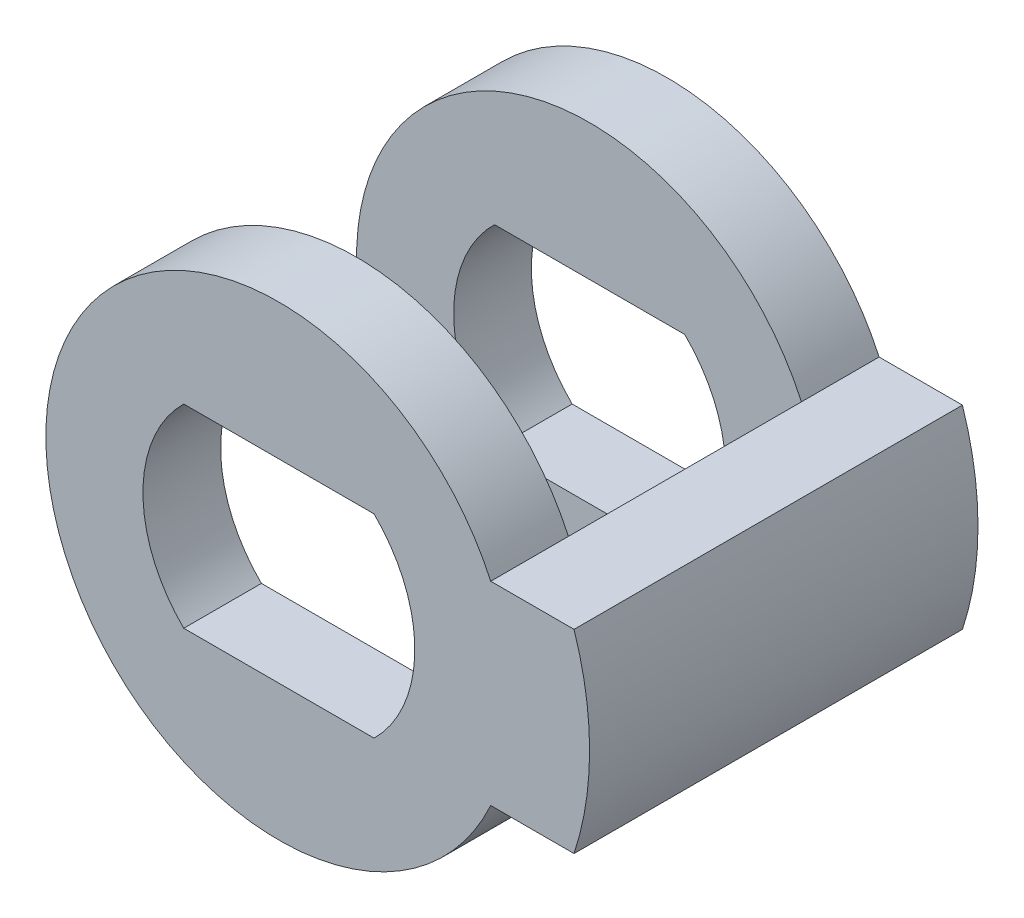
ISO-10303-21;
HEADER;
FILE_DESCRIPTION(('STEP AP214'),'2;1');
FILE_NAME('part.step','',(''),(''),'','','');
FILE_SCHEMA(('AUTOMOTIVE_DESIGN { 1 0 10303 214 1 1 1 1 }'));
ENDSEC;
DATA;
#1=APPLICATION_CONTEXT('core data for automotive mechanical design processes');
#2=APPLICATION_PROTOCOL_DEFINITION('international standard','automotive_design',2000,#1);
#3=PRODUCT_CONTEXT('',#1,'mechanical');
#4=PRODUCT('Part','Part','',(#3));
#5=PRODUCT_RELATED_PRODUCT_CATEGORY('part','',(#4));
#6=PRODUCT_DEFINITION_FORMATION('','',#4);
#7=PRODUCT_DEFINITION_CONTEXT('part definition',#1,'design');
#8=PRODUCT_DEFINITION('design','',#6,#7);
#9=PRODUCT_DEFINITION_SHAPE('','',#8);
#10=(LENGTH_UNIT() NAMED_UNIT(*) SI_UNIT(.MILLI.,.METRE.));
#11=(NAMED_UNIT(*) PLANE_ANGLE_UNIT() SI_UNIT($,.RADIAN.));
#12=(NAMED_UNIT(*) SI_UNIT($,.STERADIAN.) SOLID_ANGLE_UNIT());
#13=UNCERTAINTY_MEASURE_WITH_UNIT(LENGTH_MEASURE(1.E-05),#10,'distance_accuracy_value','');
#14=(GEOMETRIC_REPRESENTATION_CONTEXT(3) GLOBAL_UNCERTAINTY_ASSIGNED_CONTEXT((#13)) GLOBAL_UNIT_ASSIGNED_CONTEXT((#10,
#11,#12)) REPRESENTATION_CONTEXT('',''));
#15=CARTESIAN_POINT('',(0.,0.,0.));
#16=DIRECTION('',(0.,0.,1.));
#17=DIRECTION('',(1.,0.,0.));
#18=AXIS2_PLACEMENT_3D('',#15,#16,#17);
#19=CARTESIAN_POINT('',(0.,0.,-10.));
#20=DIRECTION('',(0.,0.,1.));
#21=DIRECTION('',(1.,0.,0.));
#22=AXIS2_PLACEMENT_3D('',#19,#20,#21);
#23=CYLINDRICAL_SURFACE('',#22,12.);
#24=DIRECTION('',(0.,0.,1.));
#25=VECTOR('',#24,1.);
#26=CARTESIAN_POINT('',(10.9087121146357,-5.,-10.));
#27=LINE('',#26,#25);
#28=CARTESIAN_POINT('',(10.9087121146357,-5.,-10.));
#29=VERTEX_POINT('',#28);
#30=CARTESIAN_POINT('',(10.9087121146357,-5.,-6.));
#31=VERTEX_POINT('',#30);
#32=EDGE_CURVE('E159',#29,#31,#27,.T.);
#33=ORIENTED_EDGE('',*,*,#32,.T.);
#34=CARTESIAN_POINT('',(0.,0.,-6.));
#35=DIRECTION('',(0.,0.,1.));
#36=DIRECTION('',(1.,0.,0.));
#37=AXIS2_PLACEMENT_3D('',#34,#35,#36);
#38=CIRCLE('',#37,12.);
#39=CARTESIAN_POINT('',(10.9087121146357,5.,-6.));
#40=VERTEX_POINT('',#39);
#41=EDGE_CURVE('E153',#40,#31,#38,.T.);
#42=ORIENTED_EDGE('',*,*,#41,.F.);
#43=DIRECTION('',(0.,0.,1.));
#44=VECTOR('',#43,1.);
#45=CARTESIAN_POINT('',(10.9087121146357,5.,-10.));
#46=LINE('',#45,#44);
#47=CARTESIAN_POINT('',(10.9087121146357,5.,-10.));
#48=VERTEX_POINT('',#47);
#49=EDGE_CURVE('E11',#48,#40,#46,.T.);
#50=ORIENTED_EDGE('',*,*,#49,.F.);
#51=CARTESIAN_POINT('',(0.,0.,-10.));
#52=DIRECTION('',(0.,0.,1.));
#53=DIRECTION('',(1.,0.,0.));
#54=AXIS2_PLACEMENT_3D('',#51,#52,#53);
#55=CIRCLE('',#54,12.);
#56=EDGE_CURVE('E173',#48,#29,#55,.T.);
#57=ORIENTED_EDGE('',*,*,#56,.T.);
#58=EDGE_LOOP('',(#33,#42,#50,#57));
#59=FACE_BOUND('',#58,.T.);
#60=ADVANCED_FACE('F35',(#59),#23,.T.);
#61=CARTESIAN_POINT('',(0.,0.,-10.));
#62=DIRECTION('',(0.,0.,1.));
#63=DIRECTION('',(1.,0.,0.));
#64=AXIS2_PLACEMENT_3D('',#61,#62,#63);
#65=CYLINDRICAL_SURFACE('',#64,7.);
#66=CARTESIAN_POINT('',(0.,0.,-6.));
#67=DIRECTION('',(0.,0.,1.));
#68=DIRECTION('',(1.,0.,0.));
#69=AXIS2_PLACEMENT_3D('',#66,#67,#68);
#70=CIRCLE('',#69,7.);
#71=CARTESIAN_POINT('',(4.89897948556635,5.,-6.));
#72=VERTEX_POINT('',#71);
#73=CARTESIAN_POINT('',(4.89897948556636,-5.,-6.));
#74=VERTEX_POINT('',#73);
#75=EDGE_CURVE('E52',#72,#74,#70,.F.);
#76=ORIENTED_EDGE('',*,*,#75,.F.);
#77=DIRECTION('',(0.,0.,1.));
#78=VECTOR('',#77,1.);
#79=CARTESIAN_POINT('',(4.89897948556635,5.,-10.));
#80=LINE('',#79,#78);
#81=CARTESIAN_POINT('',(4.89897948556635,5.,-10.));
#82=VERTEX_POINT('',#81);
#83=EDGE_CURVE('E192',#82,#72,#80,.T.);
#84=ORIENTED_EDGE('',*,*,#83,.F.);
#85=CARTESIAN_POINT('',(0.,0.,-10.));
#86=DIRECTION('',(0.,0.,1.));
#87=DIRECTION('',(1.,0.,0.));
#88=AXIS2_PLACEMENT_3D('',#85,#86,#87);
#89=CIRCLE('',#88,7.);
#90=CARTESIAN_POINT('',(4.89897948556636,-5.,-10.));
#91=VERTEX_POINT('',#90);
#92=EDGE_CURVE('E245',#91,#82,#89,.T.);
#93=ORIENTED_EDGE('',*,*,#92,.F.);
#94=DIRECTION('',(0.,0.,1.));
#95=VECTOR('',#94,1.);
#96=CARTESIAN_POINT('',(4.89897948556636,-5.,-10.));
#97=LINE('',#96,#95);
#98=EDGE_CURVE('E39',#91,#74,#97,.T.);
#99=ORIENTED_EDGE('',*,*,#98,.T.);
#100=EDGE_LOOP('',(#76,#84,#93,#99));
#101=FACE_BOUND('',#100,.T.);
#102=ADVANCED_FACE('F257',(#101),#65,.F.);
#103=CARTESIAN_POINT('',(0.,5.,-10.));
#104=DIRECTION('',(0.,-1.,0.));
#105=DIRECTION('',(1.,0.,0.));
#106=AXIS2_PLACEMENT_3D('',#103,#104,#105);
#107=PLANE('',#106);
#108=ORIENTED_EDGE('',*,*,#83,.T.);
#109=DIRECTION('',(-1.,0.,0.));
#110=VECTOR('',#109,1.);
#111=CARTESIAN_POINT('',(0.,5.,-6.));
#112=LINE('',#111,#110);
#113=CARTESIAN_POINT('',(-4.89897948556636,5.,-6.));
#114=VERTEX_POINT('',#113);
#115=EDGE_CURVE('E261',#72,#114,#112,.T.);
#116=ORIENTED_EDGE('',*,*,#115,.T.);
#117=DIRECTION('',(0.,0.,1.));
#118=VECTOR('',#117,1.);
#119=CARTESIAN_POINT('',(-4.89897948556636,5.,-10.));
#120=LINE('',#119,#118);
#121=CARTESIAN_POINT('',(-4.89897948556636,5.,-10.));
#122=VERTEX_POINT('',#121);
#123=EDGE_CURVE('E196',#122,#114,#120,.T.);
#124=ORIENTED_EDGE('',*,*,#123,.F.);
#125=DIRECTION('',(1.,0.,0.));
#126=VECTOR('',#125,1.);
#127=CARTESIAN_POINT('',(0.,5.,-10.));
#128=LINE('',#127,#126);
#129=EDGE_CURVE('E177',#122,#82,#128,.T.);
#130=ORIENTED_EDGE('',*,*,#129,.T.);
#131=EDGE_LOOP('',(#108,#116,#124,#130));
#132=FACE_BOUND('',#131,.T.);
#133=ADVANCED_FACE('F260',(#132),#107,.T.);
#134=CARTESIAN_POINT('',(0.,0.,-6.));
#135=DIRECTION('',(0.,0.,1.));
#136=DIRECTION('',(1.,0.,0.));
#137=AXIS2_PLACEMENT_3D('',#134,#135,#136);
#138=CIRCLE('',#137,7.);
#139=CARTESIAN_POINT('',(-4.89897948556636,-5.,-6.));
#140=VERTEX_POINT('',#139);
#141=EDGE_CURVE('E253',#140,#114,#138,.F.);
#142=ORIENTED_EDGE('',*,*,#141,.F.);
#143=DIRECTION('',(0.,0.,1.));
#144=VECTOR('',#143,1.);
#145=CARTESIAN_POINT('',(-4.89897948556636,-5.,-10.));
#146=LINE('',#145,#144);
#147=CARTESIAN_POINT('',(-4.89897948556636,-5.,-10.));
#148=VERTEX_POINT('',#147);
#149=EDGE_CURVE('E199',#148,#140,#146,.T.);
#150=ORIENTED_EDGE('',*,*,#149,.F.);
#151=EDGE_CURVE('E181',#122,#148,#89,.T.);
#152=ORIENTED_EDGE('',*,*,#151,.F.);
#153=ORIENTED_EDGE('',*,*,#123,.T.);
#154=EDGE_LOOP('',(#142,#150,#152,#153));
#155=FACE_BOUND('',#154,.T.);
#156=ADVANCED_FACE('F252',(#155),#65,.F.);
#157=CARTESIAN_POINT('',(0.,-5.,-10.));
#158=DIRECTION('',(0.,-1.,0.));
#159=DIRECTION('',(0.,0.,-1.));
#160=AXIS2_PLACEMENT_3D('',#157,#158,#159);
#161=PLANE('',#160);
#162=DIRECTION('',(-1.,0.,0.));
#163=VECTOR('',#162,1.);
#164=CARTESIAN_POINT('',(0.,-5.,-6.));
#165=LINE('',#164,#163);
#166=EDGE_CURVE('E255',#74,#140,#165,.T.);
#167=ORIENTED_EDGE('',*,*,#166,.F.);
#168=ORIENTED_EDGE('',*,*,#98,.F.);
#169=DIRECTION('',(1.,0.,0.));
#170=VECTOR('',#169,1.);
#171=CARTESIAN_POINT('',(0.,-5.,-10.));
#172=LINE('',#171,#170);
#173=EDGE_CURVE('E246',#148,#91,#172,.T.);
#174=ORIENTED_EDGE('',*,*,#173,.F.);
#175=ORIENTED_EDGE('',*,*,#149,.T.);
#176=EDGE_LOOP('',(#167,#168,#174,#175));
#177=FACE_BOUND('',#176,.T.);
#178=ADVANCED_FACE('F254',(#177),#161,.F.);
#179=CARTESIAN_POINT('',(0.,0.,6.));
#180=DIRECTION('',(0.,0.,1.));
#181=DIRECTION('',(1.,0.,0.));
#182=AXIS2_PLACEMENT_3D('',#179,#180,#181);
#183=CIRCLE('',#182,12.);
#184=CARTESIAN_POINT('',(10.9087121146357,5.,6.));
#185=VERTEX_POINT('',#184);
#186=CARTESIAN_POINT('',(10.9087121146357,-5.,6.));
#187=VERTEX_POINT('',#186);
#188=EDGE_CURVE('E303',#185,#187,#183,.T.);
#189=ORIENTED_EDGE('',*,*,#188,.T.);
#190=CARTESIAN_POINT('',(10.9087121146357,-5.,10.));
#191=VERTEX_POINT('',#190);
#192=EDGE_CURVE('E191',#187,#191,#27,.T.);
#193=ORIENTED_EDGE('',*,*,#192,.T.);
#194=CARTESIAN_POINT('',(0.,0.,10.));
#195=DIRECTION('',(0.,0.,1.));
#196=DIRECTION('',(1.,0.,0.));
#197=AXIS2_PLACEMENT_3D('',#194,#195,#196);
#198=CIRCLE('',#197,12.);
#199=CARTESIAN_POINT('',(10.9087121146357,5.,10.));
#200=VERTEX_POINT('',#199);
#201=EDGE_CURVE('E234',#200,#191,#198,.T.);
#202=ORIENTED_EDGE('',*,*,#201,.F.);
#203=EDGE_CURVE('E44',#185,#200,#46,.T.);
#204=ORIENTED_EDGE('',*,*,#203,.F.);
#205=EDGE_LOOP('',(#189,#193,#202,#204));
#206=FACE_BOUND('',#205,.T.);
#207=ADVANCED_FACE('F289',(#206),#23,.T.);
#208=CARTESIAN_POINT('',(0.,5.,-10.));
#209=DIRECTION('',(0.,-1.,0.));
#210=DIRECTION('',(0.,0.,-1.));
#211=AXIS2_PLACEMENT_3D('',#208,#209,#210);
#212=PLANE('',#211);
#213=ORIENTED_EDGE('',*,*,#49,.T.);
#214=DIRECTION('',(0.,0.,-1.));
#215=VECTOR('',#214,1.);
#216=CARTESIAN_POINT('',(10.9087121146357,5.,6.));
#217=LINE('',#216,#215);
#218=EDGE_CURVE('E138',#185,#40,#217,.T.);
#219=ORIENTED_EDGE('',*,*,#218,.F.);
#220=ORIENTED_EDGE('',*,*,#203,.T.);
#221=DIRECTION('',(1.,0.,0.));
#222=VECTOR('',#221,1.);
#223=CARTESIAN_POINT('',(0.,5.,10.));
#224=LINE('',#223,#222);
#225=CARTESIAN_POINT('',(15.1986841535707,5.,10.));
#226=VERTEX_POINT('',#225);
#227=EDGE_CURVE('E243',#200,#226,#224,.T.);
#228=ORIENTED_EDGE('',*,*,#227,.T.);
#229=DIRECTION('',(0.,0.,1.));
#230=VECTOR('',#229,1.);
#231=CARTESIAN_POINT('',(15.1986841535707,5.,-10.));
#232=LINE('',#231,#230);
#233=CARTESIAN_POINT('',(15.1986841535707,5.,-10.));
#234=VERTEX_POINT('',#233);
#235=EDGE_CURVE('E165',#234,#226,#232,.T.);
#236=ORIENTED_EDGE('',*,*,#235,.F.);
#237=DIRECTION('',(1.,0.,0.));
#238=VECTOR('',#237,1.);
#239=CARTESIAN_POINT('',(0.,5.,-10.));
#240=LINE('',#239,#238);
#241=EDGE_CURVE('E162',#48,#234,#240,.T.);
#242=ORIENTED_EDGE('',*,*,#241,.F.);
#243=EDGE_LOOP('',(#213,#219,#220,#228,#236,#242));
#244=FACE_BOUND('',#243,.T.);
#245=ADVANCED_FACE('F160',(#244),#212,.F.);
#246=CARTESIAN_POINT('',(0.,0.,-10.));
#247=DIRECTION('',(0.,0.,1.));
#248=DIRECTION('',(1.,0.,0.));
#249=AXIS2_PLACEMENT_3D('',#246,#247,#248);
#250=CYLINDRICAL_SURFACE('',#249,16.);
#251=ORIENTED_EDGE('',*,*,#235,.T.);
#252=CARTESIAN_POINT('',(0.,0.,10.));
#253=DIRECTION('',(0.,0.,1.));
#254=DIRECTION('',(1.,0.,0.));
#255=AXIS2_PLACEMENT_3D('',#252,#253,#254);
#256=CIRCLE('',#255,16.);
#257=CARTESIAN_POINT('',(15.1986841535707,-5.,10.));
#258=VERTEX_POINT('',#257);
#259=EDGE_CURVE('E240',#258,#226,#256,.T.);
#260=ORIENTED_EDGE('',*,*,#259,.F.);
#261=DIRECTION('',(0.,0.,1.));
#262=VECTOR('',#261,1.);
#263=CARTESIAN_POINT('',(15.1986841535707,-5.,-10.));
#264=LINE('',#263,#262);
#265=CARTESIAN_POINT('',(15.1986841535707,-5.,-10.));
#266=VERTEX_POINT('',#265);
#267=EDGE_CURVE('E187',#266,#258,#264,.T.);
#268=ORIENTED_EDGE('',*,*,#267,.F.);
#269=CARTESIAN_POINT('',(0.,0.,-10.));
#270=DIRECTION('',(0.,0.,1.));
#271=DIRECTION('',(1.,0.,0.));
#272=AXIS2_PLACEMENT_3D('',#269,#270,#271);
#273=CIRCLE('',#272,16.);
#274=EDGE_CURVE('E170',#266,#234,#273,.T.);
#275=ORIENTED_EDGE('',*,*,#274,.T.);
#276=EDGE_LOOP('',(#251,#260,#268,#275));
#277=FACE_BOUND('',#276,.T.);
#278=ADVANCED_FACE('F285',(#277),#250,.T.);
#279=CARTESIAN_POINT('',(4.89897948556635,5.,6.));
#280=VERTEX_POINT('',#279);
#281=CARTESIAN_POINT('',(4.89897948556635,5.,10.));
#282=VERTEX_POINT('',#281);
#283=EDGE_CURVE('E195',#280,#282,#80,.T.);
#284=ORIENTED_EDGE('',*,*,#283,.F.);
#285=CARTESIAN_POINT('',(0.,0.,6.));
#286=DIRECTION('',(0.,0.,1.));
#287=DIRECTION('',(1.,0.,0.));
#288=AXIS2_PLACEMENT_3D('',#285,#286,#287);
#289=CIRCLE('',#288,7.);
#290=CARTESIAN_POINT('',(4.89897948556636,-5.,6.));
#291=VERTEX_POINT('',#290);
#292=EDGE_CURVE('E148',#280,#291,#289,.F.);
#293=ORIENTED_EDGE('',*,*,#292,.T.);
#294=CARTESIAN_POINT('',(4.89897948556636,-5.,10.));
#295=VERTEX_POINT('',#294);
#296=EDGE_CURVE('E169',#291,#295,#97,.T.);
#297=ORIENTED_EDGE('',*,*,#296,.T.);
#298=CARTESIAN_POINT('',(0.,0.,10.));
#299=DIRECTION('',(0.,0.,1.));
#300=DIRECTION('',(1.,0.,0.));
#301=AXIS2_PLACEMENT_3D('',#298,#299,#300);
#302=CIRCLE('',#301,7.);
#303=EDGE_CURVE('E147',#295,#282,#302,.T.);
#304=ORIENTED_EDGE('',*,*,#303,.T.);
#305=EDGE_LOOP('',(#284,#293,#297,#304));
#306=FACE_BOUND('',#305,.T.);
#307=ADVANCED_FACE('F219',(#306),#65,.F.);
#308=DIRECTION('',(-1.,0.,0.));
#309=VECTOR('',#308,1.);
#310=CARTESIAN_POINT('',(0.,5.,6.));
#311=LINE('',#310,#309);
#312=CARTESIAN_POINT('',(-4.89897948556636,5.,6.));
#313=VERTEX_POINT('',#312);
#314=EDGE_CURVE('E270',#280,#313,#311,.T.);
#315=ORIENTED_EDGE('',*,*,#314,.F.);
#316=ORIENTED_EDGE('',*,*,#283,.T.);
#317=DIRECTION('',(1.,0.,0.));
#318=VECTOR('',#317,1.);
#319=CARTESIAN_POINT('',(0.,5.,10.));
#320=LINE('',#319,#318);
#321=CARTESIAN_POINT('',(-4.89897948556636,5.,10.));
#322=VERTEX_POINT('',#321);
#323=EDGE_CURVE('E228',#322,#282,#320,.T.);
#324=ORIENTED_EDGE('',*,*,#323,.F.);
#325=EDGE_CURVE('E198',#313,#322,#120,.T.);
#326=ORIENTED_EDGE('',*,*,#325,.F.);
#327=EDGE_LOOP('',(#315,#316,#324,#326));
#328=FACE_BOUND('',#327,.T.);
#329=ADVANCED_FACE('F278',(#328),#107,.T.);
#330=CARTESIAN_POINT('',(-4.89897948556636,-5.,6.));
#331=VERTEX_POINT('',#330);
#332=CARTESIAN_POINT('',(-4.89897948556636,-5.,10.));
#333=VERTEX_POINT('',#332);
#334=EDGE_CURVE('E201',#331,#333,#146,.T.);
#335=ORIENTED_EDGE('',*,*,#334,.F.);
#336=CARTESIAN_POINT('',(0.,0.,6.));
#337=DIRECTION('',(0.,0.,1.));
#338=DIRECTION('',(1.,0.,0.));
#339=AXIS2_PLACEMENT_3D('',#336,#337,#338);
#340=CIRCLE('',#339,7.);
#341=EDGE_CURVE('E60',#331,#313,#340,.F.);
#342=ORIENTED_EDGE('',*,*,#341,.T.);
#343=ORIENTED_EDGE('',*,*,#325,.T.);
#344=EDGE_CURVE('E230',#322,#333,#302,.T.);
#345=ORIENTED_EDGE('',*,*,#344,.T.);
#346=EDGE_LOOP('',(#335,#342,#343,#345));
#347=FACE_BOUND('',#346,.T.);
#348=ADVANCED_FACE('F277',(#347),#65,.F.);
#349=ORIENTED_EDGE('',*,*,#296,.F.);
#350=DIRECTION('',(-1.,0.,0.));
#351=VECTOR('',#350,1.);
#352=CARTESIAN_POINT('',(0.,-5.,6.));
#353=LINE('',#352,#351);
#354=EDGE_CURVE('E263',#291,#331,#353,.T.);
#355=ORIENTED_EDGE('',*,*,#354,.T.);
#356=ORIENTED_EDGE('',*,*,#334,.T.);
#357=DIRECTION('',(1.,0.,0.));
#358=VECTOR('',#357,1.);
#359=CARTESIAN_POINT('',(0.,-5.,10.));
#360=LINE('',#359,#358);
#361=EDGE_CURVE('E225',#333,#295,#360,.T.);
#362=ORIENTED_EDGE('',*,*,#361,.T.);
#363=EDGE_LOOP('',(#349,#355,#356,#362));
#364=FACE_BOUND('',#363,.T.);
#365=ADVANCED_FACE('F37',(#364),#161,.F.);
#366=CARTESIAN_POINT('',(0.,-5.,-10.));
#367=DIRECTION('',(0.,-1.,0.));
#368=DIRECTION('',(0.,0.,-1.));
#369=AXIS2_PLACEMENT_3D('',#366,#367,#368);
#370=PLANE('',#369);
#371=ORIENTED_EDGE('',*,*,#267,.T.);
#372=DIRECTION('',(1.,0.,0.));
#373=VECTOR('',#372,1.);
#374=CARTESIAN_POINT('',(0.,-5.,10.));
#375=LINE('',#374,#373);
#376=EDGE_CURVE('E237',#191,#258,#375,.T.);
#377=ORIENTED_EDGE('',*,*,#376,.F.);
#378=ORIENTED_EDGE('',*,*,#192,.F.);
#379=EDGE_CURVE('E190',#31,#187,#27,.T.);
#380=ORIENTED_EDGE('',*,*,#379,.F.);
#381=ORIENTED_EDGE('',*,*,#32,.F.);
#382=DIRECTION('',(1.,0.,0.));
#383=VECTOR('',#382,1.);
#384=CARTESIAN_POINT('',(0.,-5.,-10.));
#385=LINE('',#384,#383);
#386=EDGE_CURVE('E176',#29,#266,#385,.T.);
#387=ORIENTED_EDGE('',*,*,#386,.T.);
#388=EDGE_LOOP('',(#371,#377,#378,#380,#381,#387));
#389=FACE_BOUND('',#388,.T.);
#390=ADVANCED_FACE('F310',(#389),#370,.T.);
#391=CARTESIAN_POINT('',(0.,0.,-10.));
#392=DIRECTION('',(0.,0.,1.));
#393=DIRECTION('',(1.,0.,0.));
#394=AXIS2_PLACEMENT_3D('',#391,#392,#393);
#395=PLANE('',#394);
#396=ORIENTED_EDGE('',*,*,#92,.T.);
#397=ORIENTED_EDGE('',*,*,#129,.F.);
#398=ORIENTED_EDGE('',*,*,#151,.T.);
#399=ORIENTED_EDGE('',*,*,#173,.T.);
#400=EDGE_LOOP('',(#396,#397,#398,#399));
#401=FACE_BOUND('',#400,.T.);
#402=ORIENTED_EDGE('',*,*,#56,.F.);
#403=ORIENTED_EDGE('',*,*,#241,.T.);
#404=ORIENTED_EDGE('',*,*,#274,.F.);
#405=ORIENTED_EDGE('',*,*,#386,.F.);
#406=EDGE_LOOP('',(#402,#403,#404,#405));
#407=FACE_BOUND('',#406,.T.);
#408=ADVANCED_FACE('F174',(#401,#407),#395,.F.);
#409=CARTESIAN_POINT('',(0.,0.,10.));
#410=DIRECTION('',(0.,0.,1.));
#411=DIRECTION('',(1.,0.,0.));
#412=AXIS2_PLACEMENT_3D('',#409,#410,#411);
#413=PLANE('',#412);
#414=ORIENTED_EDGE('',*,*,#303,.F.);
#415=ORIENTED_EDGE('',*,*,#361,.F.);
#416=ORIENTED_EDGE('',*,*,#344,.F.);
#417=ORIENTED_EDGE('',*,*,#323,.T.);
#418=EDGE_LOOP('',(#414,#415,#416,#417));
#419=FACE_BOUND('',#418,.T.);
#420=ORIENTED_EDGE('',*,*,#201,.T.);
#421=ORIENTED_EDGE('',*,*,#376,.T.);
#422=ORIENTED_EDGE('',*,*,#259,.T.);
#423=ORIENTED_EDGE('',*,*,#227,.F.);
#424=EDGE_LOOP('',(#420,#421,#422,#423));
#425=FACE_BOUND('',#424,.T.);
#426=ADVANCED_FACE('F222',(#419,#425),#413,.T.);
#427=CARTESIAN_POINT('',(0.,0.,6.));
#428=DIRECTION('',(0.,0.,-1.));
#429=DIRECTION('',(-1.,0.,0.));
#430=AXIS2_PLACEMENT_3D('',#427,#428,#429);
#431=CYLINDRICAL_SURFACE('',#430,12.);
#432=ORIENTED_EDGE('',*,*,#218,.T.);
#433=EDGE_CURVE('E141',#31,#40,#38,.T.);
#434=ORIENTED_EDGE('',*,*,#433,.F.);
#435=ORIENTED_EDGE('',*,*,#379,.T.);
#436=EDGE_CURVE('E144',#187,#185,#183,.T.);
#437=ORIENTED_EDGE('',*,*,#436,.T.);
#438=EDGE_LOOP('',(#432,#434,#435,#437));
#439=FACE_BOUND('',#438,.T.);
#440=ADVANCED_FACE('F140',(#439),#431,.F.);
#441=CARTESIAN_POINT('',(0.,0.,6.));
#442=DIRECTION('',(0.,0.,1.));
#443=DIRECTION('',(1.,0.,0.));
#444=AXIS2_PLACEMENT_3D('',#441,#442,#443);
#445=PLANE('',#444);
#446=ORIENTED_EDGE('',*,*,#188,.F.);
#447=ORIENTED_EDGE('',*,*,#436,.F.);
#448=EDGE_LOOP('',(#446,#447));
#449=FACE_BOUND('',#448,.T.);
#450=ORIENTED_EDGE('',*,*,#314,.T.);
#451=ORIENTED_EDGE('',*,*,#341,.F.);
#452=ORIENTED_EDGE('',*,*,#354,.F.);
#453=ORIENTED_EDGE('',*,*,#292,.F.);
#454=EDGE_LOOP('',(#450,#451,#452,#453));
#455=FACE_BOUND('',#454,.T.);
#456=ADVANCED_FACE('F273',(#449,#455),#445,.F.);
#457=CARTESIAN_POINT('',(0.,0.,-6.));
#458=DIRECTION('',(0.,0.,1.));
#459=DIRECTION('',(1.,0.,0.));
#460=AXIS2_PLACEMENT_3D('',#457,#458,#459);
#461=PLANE('',#460);
#462=ORIENTED_EDGE('',*,*,#41,.T.);
#463=ORIENTED_EDGE('',*,*,#433,.T.);
#464=EDGE_LOOP('',(#462,#463));
#465=FACE_BOUND('',#464,.T.);
#466=ORIENTED_EDGE('',*,*,#75,.T.);
#467=ORIENTED_EDGE('',*,*,#166,.T.);
#468=ORIENTED_EDGE('',*,*,#141,.T.);
#469=ORIENTED_EDGE('',*,*,#115,.F.);
#470=EDGE_LOOP('',(#466,#467,#468,#469));
#471=FACE_BOUND('',#470,.T.);
#472=ADVANCED_FACE('F152',(#465,#471),#461,.T.);
#473=CLOSED_SHELL('',(#60,#102,#133,#156,#178,#207,#245,#278,#307,#329,#348,#365,#390,#408,#426,
#440,#456,#472));
#474=MANIFOLD_SOLID_BREP('B2',#473);
#475=ADVANCED_BREP_SHAPE_REPRESENTATION('',(#18,#474),#14);
#476=SHAPE_DEFINITION_REPRESENTATION(#9,#475);
ENDSEC;
END-ISO-10303-21;
